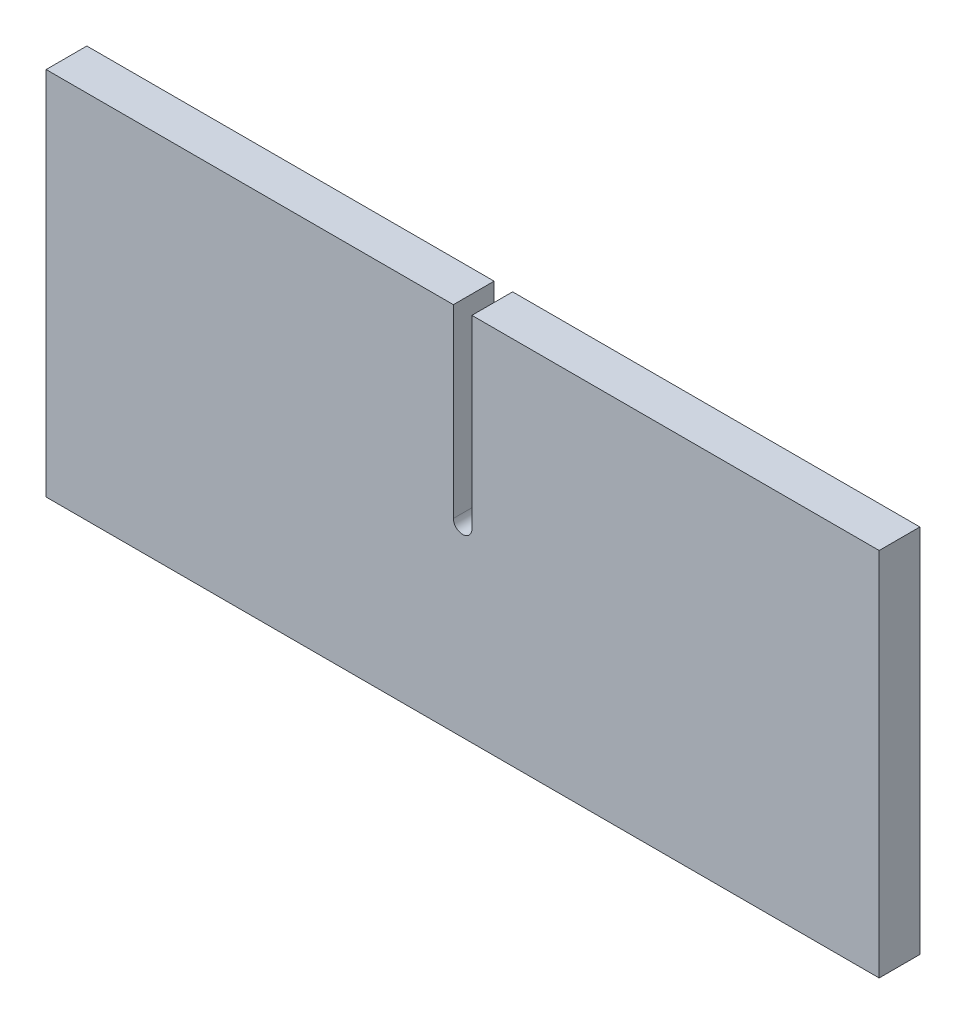
ISO-10303-21;
HEADER;
FILE_DESCRIPTION(('STEP AP214'),'2;1');
FILE_NAME('part.step','',(''),(''),'','','');
FILE_SCHEMA(('AUTOMOTIVE_DESIGN { 1 0 10303 214 1 1 1 1 }'));
ENDSEC;
DATA;
#1=APPLICATION_CONTEXT('core data for automotive mechanical design processes');
#2=APPLICATION_PROTOCOL_DEFINITION('international standard','automotive_design',2000,#1);
#3=PRODUCT_CONTEXT('',#1,'mechanical');
#4=PRODUCT('Part','Part','',(#3));
#5=PRODUCT_RELATED_PRODUCT_CATEGORY('part','',(#4));
#6=PRODUCT_DEFINITION_FORMATION('','',#4);
#7=PRODUCT_DEFINITION_CONTEXT('part definition',#1,'design');
#8=PRODUCT_DEFINITION('design','',#6,#7);
#9=PRODUCT_DEFINITION_SHAPE('','',#8);
#10=(LENGTH_UNIT() NAMED_UNIT(*) SI_UNIT(.MILLI.,.METRE.));
#11=(NAMED_UNIT(*) PLANE_ANGLE_UNIT() SI_UNIT($,.RADIAN.));
#12=(NAMED_UNIT(*) SI_UNIT($,.STERADIAN.) SOLID_ANGLE_UNIT());
#13=UNCERTAINTY_MEASURE_WITH_UNIT(LENGTH_MEASURE(1.E-05),#10,'distance_accuracy_value','');
#14=(GEOMETRIC_REPRESENTATION_CONTEXT(3) GLOBAL_UNCERTAINTY_ASSIGNED_CONTEXT((#13)) GLOBAL_UNIT_ASSIGNED_CONTEXT((#10,
#11,#12)) REPRESENTATION_CONTEXT('',''));
#15=CARTESIAN_POINT('',(0.,0.,0.));
#16=DIRECTION('',(0.,0.,1.));
#17=DIRECTION('',(1.,0.,0.));
#18=AXIS2_PLACEMENT_3D('',#15,#16,#17);
#19=CARTESIAN_POINT('',(225.,100.,22.));
#20=DIRECTION('',(-1.,0.,0.));
#21=DIRECTION('',(0.,-1.,0.));
#22=AXIS2_PLACEMENT_3D('',#19,#20,#21);
#23=PLANE('',#22);
#24=DIRECTION('',(0.,1.,0.));
#25=VECTOR('',#24,1.);
#26=CARTESIAN_POINT('',(225.,100.,0.));
#27=LINE('',#26,#25);
#28=CARTESIAN_POINT('',(225.,-100.,0.));
#29=VERTEX_POINT('',#28);
#30=CARTESIAN_POINT('',(225.,100.,0.));
#31=VERTEX_POINT('',#30);
#32=EDGE_CURVE('E144',#29,#31,#27,.T.);
#33=ORIENTED_EDGE('',*,*,#32,.T.);
#34=DIRECTION('',(0.,0.,-1.));
#35=VECTOR('',#34,1.);
#36=CARTESIAN_POINT('',(225.,100.,22.));
#37=LINE('',#36,#35);
#38=CARTESIAN_POINT('',(225.,100.,22.));
#39=VERTEX_POINT('',#38);
#40=EDGE_CURVE('E11',#39,#31,#37,.T.);
#41=ORIENTED_EDGE('',*,*,#40,.F.);
#42=DIRECTION('',(0.,1.,0.));
#43=VECTOR('',#42,1.);
#44=CARTESIAN_POINT('',(225.,100.,22.));
#45=LINE('',#44,#43);
#46=CARTESIAN_POINT('',(225.,-100.,22.));
#47=VERTEX_POINT('',#46);
#48=EDGE_CURVE('E166',#47,#39,#45,.T.);
#49=ORIENTED_EDGE('',*,*,#48,.F.);
#50=DIRECTION('',(0.,0.,-1.));
#51=VECTOR('',#50,1.);
#52=CARTESIAN_POINT('',(225.,-100.,22.));
#53=LINE('',#52,#51);
#54=EDGE_CURVE('E140',#47,#29,#53,.T.);
#55=ORIENTED_EDGE('',*,*,#54,.T.);
#56=EDGE_LOOP('',(#33,#41,#49,#55));
#57=FACE_BOUND('',#56,.T.);
#58=ADVANCED_FACE('F43',(#57),#23,.F.);
#59=CARTESIAN_POINT('',(5.,100.,22.));
#60=DIRECTION('',(0.,-1.,0.));
#61=DIRECTION('',(0.,0.,-1.));
#62=AXIS2_PLACEMENT_3D('',#59,#60,#61);
#63=PLANE('',#62);
#64=DIRECTION('',(-1.,0.,0.));
#65=VECTOR('',#64,1.);
#66=CARTESIAN_POINT('',(5.,100.,0.));
#67=LINE('',#66,#65);
#68=CARTESIAN_POINT('',(5.,100.,0.));
#69=VERTEX_POINT('',#68);
#70=EDGE_CURVE('E148',#31,#69,#67,.T.);
#71=ORIENTED_EDGE('',*,*,#70,.T.);
#72=DIRECTION('',(0.,0.,-1.));
#73=VECTOR('',#72,1.);
#74=CARTESIAN_POINT('',(5.,100.,22.));
#75=LINE('',#74,#73);
#76=CARTESIAN_POINT('',(5.,100.,22.));
#77=VERTEX_POINT('',#76);
#78=EDGE_CURVE('E52',#77,#69,#75,.T.);
#79=ORIENTED_EDGE('',*,*,#78,.F.);
#80=DIRECTION('',(-1.,0.,0.));
#81=VECTOR('',#80,1.);
#82=CARTESIAN_POINT('',(5.,100.,22.));
#83=LINE('',#82,#81);
#84=EDGE_CURVE('E103',#39,#77,#83,.T.);
#85=ORIENTED_EDGE('',*,*,#84,.F.);
#86=ORIENTED_EDGE('',*,*,#40,.T.);
#87=EDGE_LOOP('',(#71,#79,#85,#86));
#88=FACE_BOUND('',#87,.T.);
#89=ADVANCED_FACE('F212',(#88),#63,.F.);
#90=CARTESIAN_POINT('',(5.,100.,22.));
#91=DIRECTION('',(1.,0.,0.));
#92=DIRECTION('',(0.,1.,0.));
#93=AXIS2_PLACEMENT_3D('',#90,#91,#92);
#94=PLANE('',#93);
#95=DIRECTION('',(0.,-1.,0.));
#96=VECTOR('',#95,1.);
#97=CARTESIAN_POINT('',(5.,100.,0.));
#98=LINE('',#97,#96);
#99=CARTESIAN_POINT('',(4.99999999999995,0.,0.));
#100=VERTEX_POINT('',#99);
#101=EDGE_CURVE('E151',#69,#100,#98,.T.);
#102=ORIENTED_EDGE('',*,*,#101,.T.);
#103=DIRECTION('',(0.,0.,-1.));
#104=VECTOR('',#103,1.);
#105=CARTESIAN_POINT('',(4.99999999999995,0.,22.));
#106=LINE('',#105,#104);
#107=CARTESIAN_POINT('',(4.99999999999995,0.,22.));
#108=VERTEX_POINT('',#107);
#109=EDGE_CURVE('E177',#108,#100,#106,.T.);
#110=ORIENTED_EDGE('',*,*,#109,.F.);
#111=DIRECTION('',(0.,-1.,0.));
#112=VECTOR('',#111,1.);
#113=CARTESIAN_POINT('',(5.,100.,22.));
#114=LINE('',#113,#112);
#115=EDGE_CURVE('E187',#77,#108,#114,.T.);
#116=ORIENTED_EDGE('',*,*,#115,.F.);
#117=ORIENTED_EDGE('',*,*,#78,.T.);
#118=EDGE_LOOP('',(#102,#110,#116,#117));
#119=FACE_BOUND('',#118,.T.);
#120=ADVANCED_FACE('F185',(#119),#94,.F.);
#121=CARTESIAN_POINT('',(0.,0.,22.));
#122=DIRECTION('',(0.,0.,-1.));
#123=DIRECTION('',(-1.,0.,0.));
#124=AXIS2_PLACEMENT_3D('',#121,#122,#123);
#125=CYLINDRICAL_SURFACE('',#124,5.00000000000001);
#126=CARTESIAN_POINT('',(0.,0.,0.));
#127=DIRECTION('',(0.,0.,-1.));
#128=DIRECTION('',(1.,0.,0.));
#129=AXIS2_PLACEMENT_3D('',#126,#127,#128);
#130=CIRCLE('',#129,5.00000000000001);
#131=CARTESIAN_POINT('',(-5.,0.,0.));
#132=VERTEX_POINT('',#131);
#133=EDGE_CURVE('E154',#100,#132,#130,.T.);
#134=ORIENTED_EDGE('',*,*,#133,.T.);
#135=DIRECTION('',(0.,0.,-1.));
#136=VECTOR('',#135,1.);
#137=CARTESIAN_POINT('',(-5.,0.,22.));
#138=LINE('',#137,#136);
#139=CARTESIAN_POINT('',(-5.,0.,22.));
#140=VERTEX_POINT('',#139);
#141=EDGE_CURVE('E173',#140,#132,#138,.T.);
#142=ORIENTED_EDGE('',*,*,#141,.F.);
#143=CARTESIAN_POINT('',(0.,0.,22.));
#144=DIRECTION('',(0.,0.,-1.));
#145=DIRECTION('',(1.,0.,0.));
#146=AXIS2_PLACEMENT_3D('',#143,#144,#145);
#147=CIRCLE('',#146,5.00000000000001);
#148=EDGE_CURVE('E200',#108,#140,#147,.T.);
#149=ORIENTED_EDGE('',*,*,#148,.F.);
#150=ORIENTED_EDGE('',*,*,#109,.T.);
#151=EDGE_LOOP('',(#134,#142,#149,#150));
#152=FACE_BOUND('',#151,.T.);
#153=ADVANCED_FACE('F195',(#152),#125,.F.);
#154=CARTESIAN_POINT('',(-5.00000000000001,100.,22.));
#155=DIRECTION('',(-1.,0.,0.));
#156=DIRECTION('',(0.,-1.,0.));
#157=AXIS2_PLACEMENT_3D('',#154,#155,#156);
#158=PLANE('',#157);
#159=DIRECTION('',(0.,1.,0.));
#160=VECTOR('',#159,1.);
#161=CARTESIAN_POINT('',(-5.00000000000001,100.,0.));
#162=LINE('',#161,#160);
#163=CARTESIAN_POINT('',(-5.00000000000001,100.,0.));
#164=VERTEX_POINT('',#163);
#165=EDGE_CURVE('E157',#132,#164,#162,.T.);
#166=ORIENTED_EDGE('',*,*,#165,.T.);
#167=DIRECTION('',(0.,0.,-1.));
#168=VECTOR('',#167,1.);
#169=CARTESIAN_POINT('',(-5.00000000000001,100.,22.));
#170=LINE('',#169,#168);
#171=CARTESIAN_POINT('',(-5.00000000000001,100.,22.));
#172=VERTEX_POINT('',#171);
#173=EDGE_CURVE('E133',#172,#164,#170,.T.);
#174=ORIENTED_EDGE('',*,*,#173,.F.);
#175=DIRECTION('',(0.,1.,0.));
#176=VECTOR('',#175,1.);
#177=CARTESIAN_POINT('',(-5.00000000000001,100.,22.));
#178=LINE('',#177,#176);
#179=EDGE_CURVE('E122',#140,#172,#178,.T.);
#180=ORIENTED_EDGE('',*,*,#179,.F.);
#181=ORIENTED_EDGE('',*,*,#141,.T.);
#182=EDGE_LOOP('',(#166,#174,#180,#181));
#183=FACE_BOUND('',#182,.T.);
#184=ADVANCED_FACE('F198',(#183),#158,.F.);
#185=CARTESIAN_POINT('',(-225.,100.,22.));
#186=DIRECTION('',(0.,-1.,0.));
#187=DIRECTION('',(0.,0.,-1.));
#188=AXIS2_PLACEMENT_3D('',#185,#186,#187);
#189=PLANE('',#188);
#190=DIRECTION('',(-1.,0.,0.));
#191=VECTOR('',#190,1.);
#192=CARTESIAN_POINT('',(-225.,100.,0.));
#193=LINE('',#192,#191);
#194=CARTESIAN_POINT('',(-225.,100.,0.));
#195=VERTEX_POINT('',#194);
#196=EDGE_CURVE('E131',#164,#195,#193,.T.);
#197=ORIENTED_EDGE('',*,*,#196,.T.);
#198=DIRECTION('',(0.,0.,-1.));
#199=VECTOR('',#198,1.);
#200=CARTESIAN_POINT('',(-225.,100.,22.));
#201=LINE('',#200,#199);
#202=CARTESIAN_POINT('',(-225.,100.,22.));
#203=VERTEX_POINT('',#202);
#204=EDGE_CURVE('E128',#203,#195,#201,.T.);
#205=ORIENTED_EDGE('',*,*,#204,.F.);
#206=DIRECTION('',(-1.,0.,0.));
#207=VECTOR('',#206,1.);
#208=CARTESIAN_POINT('',(-225.,100.,22.));
#209=LINE('',#208,#207);
#210=EDGE_CURVE('E116',#172,#203,#209,.T.);
#211=ORIENTED_EDGE('',*,*,#210,.F.);
#212=ORIENTED_EDGE('',*,*,#173,.T.);
#213=EDGE_LOOP('',(#197,#205,#211,#212));
#214=FACE_BOUND('',#213,.T.);
#215=ADVANCED_FACE('F129',(#214),#189,.F.);
#216=CARTESIAN_POINT('',(-225.,100.,22.));
#217=DIRECTION('',(1.,0.,0.));
#218=DIRECTION('',(0.,1.,0.));
#219=AXIS2_PLACEMENT_3D('',#216,#217,#218);
#220=PLANE('',#219);
#221=DIRECTION('',(0.,-1.,0.));
#222=VECTOR('',#221,1.);
#223=CARTESIAN_POINT('',(-225.,100.,0.));
#224=LINE('',#223,#222);
#225=CARTESIAN_POINT('',(-225.,-100.,0.));
#226=VERTEX_POINT('',#225);
#227=EDGE_CURVE('E89',#195,#226,#224,.T.);
#228=ORIENTED_EDGE('',*,*,#227,.T.);
#229=DIRECTION('',(0.,0.,-1.));
#230=VECTOR('',#229,1.);
#231=CARTESIAN_POINT('',(-225.,-100.,22.));
#232=LINE('',#231,#230);
#233=CARTESIAN_POINT('',(-225.,-100.,22.));
#234=VERTEX_POINT('',#233);
#235=EDGE_CURVE('E134',#234,#226,#232,.T.);
#236=ORIENTED_EDGE('',*,*,#235,.F.);
#237=DIRECTION('',(0.,-1.,0.));
#238=VECTOR('',#237,1.);
#239=CARTESIAN_POINT('',(-225.,100.,22.));
#240=LINE('',#239,#238);
#241=EDGE_CURVE('E120',#203,#234,#240,.T.);
#242=ORIENTED_EDGE('',*,*,#241,.F.);
#243=ORIENTED_EDGE('',*,*,#204,.T.);
#244=EDGE_LOOP('',(#228,#236,#242,#243));
#245=FACE_BOUND('',#244,.T.);
#246=ADVANCED_FACE('F136',(#245),#220,.F.);
#247=CARTESIAN_POINT('',(-225.,-100.,22.));
#248=DIRECTION('',(0.,1.,0.));
#249=DIRECTION('',(0.,0.,1.));
#250=AXIS2_PLACEMENT_3D('',#247,#248,#249);
#251=PLANE('',#250);
#252=DIRECTION('',(1.,0.,0.));
#253=VECTOR('',#252,1.);
#254=CARTESIAN_POINT('',(-225.,-100.,0.));
#255=LINE('',#254,#253);
#256=EDGE_CURVE('E95',#226,#29,#255,.T.);
#257=ORIENTED_EDGE('',*,*,#256,.T.);
#258=ORIENTED_EDGE('',*,*,#54,.F.);
#259=DIRECTION('',(1.,0.,0.));
#260=VECTOR('',#259,1.);
#261=CARTESIAN_POINT('',(-225.,-100.,22.));
#262=LINE('',#261,#260);
#263=EDGE_CURVE('E60',#234,#47,#262,.T.);
#264=ORIENTED_EDGE('',*,*,#263,.F.);
#265=ORIENTED_EDGE('',*,*,#235,.T.);
#266=EDGE_LOOP('',(#257,#258,#264,#265));
#267=FACE_BOUND('',#266,.T.);
#268=ADVANCED_FACE('F228',(#267),#251,.F.);
#269=CARTESIAN_POINT('',(0.,0.,22.));
#270=DIRECTION('',(0.,0.,1.));
#271=DIRECTION('',(1.,0.,0.));
#272=AXIS2_PLACEMENT_3D('',#269,#270,#271);
#273=PLANE('',#272);
#274=ORIENTED_EDGE('',*,*,#48,.T.);
#275=ORIENTED_EDGE('',*,*,#84,.T.);
#276=ORIENTED_EDGE('',*,*,#115,.T.);
#277=ORIENTED_EDGE('',*,*,#148,.T.);
#278=ORIENTED_EDGE('',*,*,#179,.T.);
#279=ORIENTED_EDGE('',*,*,#210,.T.);
#280=ORIENTED_EDGE('',*,*,#241,.T.);
#281=ORIENTED_EDGE('',*,*,#263,.T.);
#282=EDGE_LOOP('',(#274,#275,#276,#277,#278,#279,#280,#281));
#283=FACE_BOUND('',#282,.T.);
#284=ADVANCED_FACE('F118',(#283),#273,.T.);
#285=CARTESIAN_POINT('',(0.,0.,0.));
#286=DIRECTION('',(0.,0.,1.));
#287=DIRECTION('',(1.,0.,0.));
#288=AXIS2_PLACEMENT_3D('',#285,#286,#287);
#289=PLANE('',#288);
#290=ORIENTED_EDGE('',*,*,#32,.F.);
#291=ORIENTED_EDGE('',*,*,#256,.F.);
#292=ORIENTED_EDGE('',*,*,#227,.F.);
#293=ORIENTED_EDGE('',*,*,#196,.F.);
#294=ORIENTED_EDGE('',*,*,#165,.F.);
#295=ORIENTED_EDGE('',*,*,#133,.F.);
#296=ORIENTED_EDGE('',*,*,#101,.F.);
#297=ORIENTED_EDGE('',*,*,#70,.F.);
#298=EDGE_LOOP('',(#290,#291,#292,#293,#294,#295,#296,#297));
#299=FACE_BOUND('',#298,.T.);
#300=ADVANCED_FACE('F191',(#299),#289,.F.);
#301=CLOSED_SHELL('',(#58,#89,#120,#153,#184,#215,#246,#268,#284,#300));
#302=MANIFOLD_SOLID_BREP('B2',#301);
#303=ADVANCED_BREP_SHAPE_REPRESENTATION('',(#18,#302),#14);
#304=SHAPE_DEFINITION_REPRESENTATION(#9,#303);
ENDSEC;
END-ISO-10303-21;
